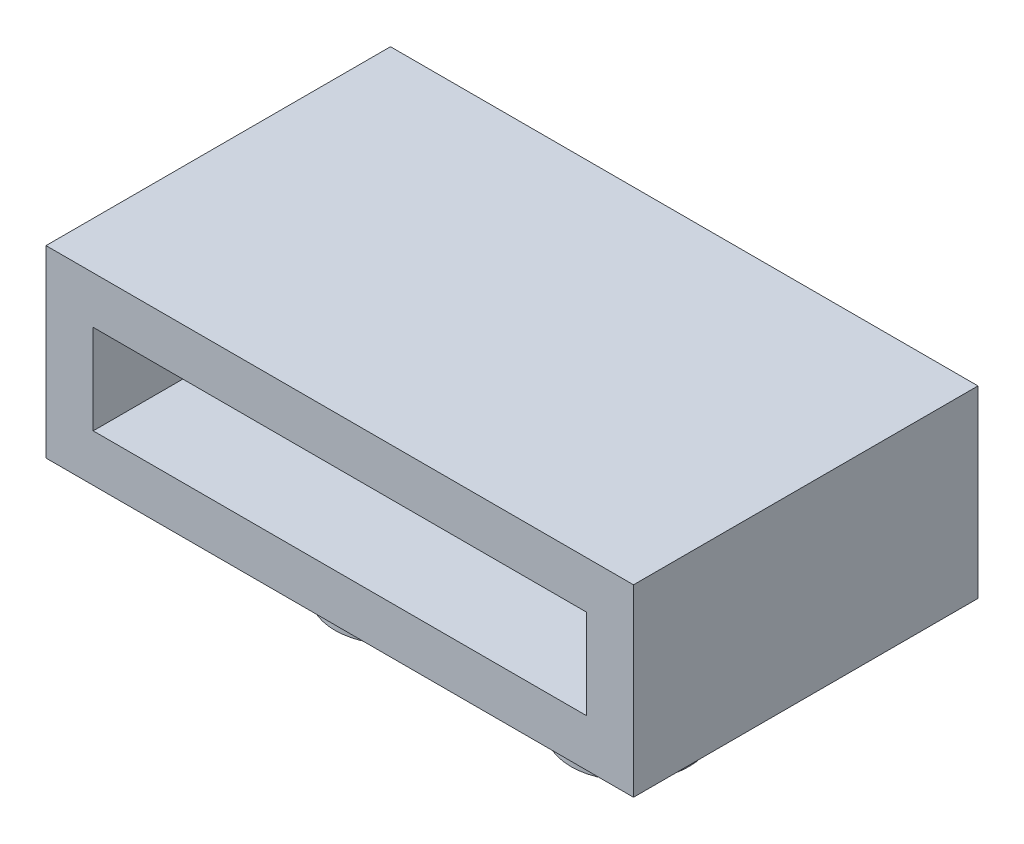
ISO-10303-21;
HEADER;
FILE_DESCRIPTION(('STEP AP214'),'2;1');
FILE_NAME('part.step','',(''),(''),'','','');
FILE_SCHEMA(('AUTOMOTIVE_DESIGN { 1 0 10303 214 1 1 1 1 }'));
ENDSEC;
DATA;
#1=APPLICATION_CONTEXT('core data for automotive mechanical design processes');
#2=APPLICATION_PROTOCOL_DEFINITION('international standard','automotive_design',2000,#1);
#3=PRODUCT_CONTEXT('',#1,'mechanical');
#4=PRODUCT('Part','Part','',(#3));
#5=PRODUCT_RELATED_PRODUCT_CATEGORY('part','',(#4));
#6=PRODUCT_DEFINITION_FORMATION('','',#4);
#7=PRODUCT_DEFINITION_CONTEXT('part definition',#1,'design');
#8=PRODUCT_DEFINITION('design','',#6,#7);
#9=PRODUCT_DEFINITION_SHAPE('','',#8);
#10=(LENGTH_UNIT() NAMED_UNIT(*) SI_UNIT(.MILLI.,.METRE.));
#11=(NAMED_UNIT(*) PLANE_ANGLE_UNIT() SI_UNIT($,.RADIAN.));
#12=(NAMED_UNIT(*) SI_UNIT($,.STERADIAN.) SOLID_ANGLE_UNIT());
#13=UNCERTAINTY_MEASURE_WITH_UNIT(LENGTH_MEASURE(1.E-05),#10,'distance_accuracy_value','');
#14=(GEOMETRIC_REPRESENTATION_CONTEXT(3) GLOBAL_UNCERTAINTY_ASSIGNED_CONTEXT((#13)) GLOBAL_UNIT_ASSIGNED_CONTEXT((#10,
#11,#12)) REPRESENTATION_CONTEXT('',''));
#15=CARTESIAN_POINT('',(0.,0.,0.));
#16=DIRECTION('',(0.,0.,1.));
#17=DIRECTION('',(1.,0.,0.));
#18=AXIS2_PLACEMENT_3D('',#15,#16,#17);
#19=CARTESIAN_POINT('',(20.9,3.8,0.));
#20=DIRECTION('',(-1.,0.,0.));
#21=DIRECTION('',(0.,0.,1.));
#22=AXIS2_PLACEMENT_3D('',#19,#20,#21);
#23=PLANE('',#22);
#24=DIRECTION('',(0.,0.,-1.));
#25=VECTOR('',#24,1.);
#26=CARTESIAN_POINT('',(20.9,0.,0.));
#27=LINE('',#26,#25);
#28=CARTESIAN_POINT('',(20.9,0.,0.));
#29=VERTEX_POINT('',#28);
#30=CARTESIAN_POINT('',(20.9,0.,-12.6));
#31=VERTEX_POINT('',#30);
#32=EDGE_CURVE('E173',#29,#31,#27,.T.);
#33=ORIENTED_EDGE('',*,*,#32,.F.);
#34=DIRECTION('',(0.,-1.,0.));
#35=VECTOR('',#34,1.);
#36=CARTESIAN_POINT('',(20.9,3.8,0.));
#37=LINE('',#36,#35);
#38=CARTESIAN_POINT('',(20.9,3.8,0.));
#39=VERTEX_POINT('',#38);
#40=EDGE_CURVE('E212',#39,#29,#37,.T.);
#41=ORIENTED_EDGE('',*,*,#40,.F.);
#42=DIRECTION('',(0.,0.,-1.));
#43=VECTOR('',#42,1.);
#44=CARTESIAN_POINT('',(20.9,3.8,0.));
#45=LINE('',#44,#43);
#46=CARTESIAN_POINT('',(20.9,3.8,-12.6));
#47=VERTEX_POINT('',#46);
#48=EDGE_CURVE('E176',#39,#47,#45,.T.);
#49=ORIENTED_EDGE('',*,*,#48,.T.);
#50=DIRECTION('',(0.,-1.,0.));
#51=VECTOR('',#50,1.);
#52=CARTESIAN_POINT('',(20.9,3.8,-12.6));
#53=LINE('',#52,#51);
#54=EDGE_CURVE('E188',#47,#31,#53,.T.);
#55=ORIENTED_EDGE('',*,*,#54,.T.);
#56=EDGE_LOOP('',(#33,#41,#49,#55));
#57=FACE_BOUND('',#56,.T.);
#58=ADVANCED_FACE('F49',(#57),#23,.T.);
#59=CARTESIAN_POINT('',(22.9,3.8,0.));
#60=DIRECTION('',(-1.,0.,0.));
#61=DIRECTION('',(0.,0.,1.));
#62=AXIS2_PLACEMENT_3D('',#59,#60,#61);
#63=PLANE('',#62);
#64=DIRECTION('',(0.,-1.,0.));
#65=VECTOR('',#64,1.);
#66=CARTESIAN_POINT('',(22.9,3.8,0.));
#67=LINE('',#66,#65);
#68=CARTESIAN_POINT('',(22.9,5.8,0.));
#69=VERTEX_POINT('',#68);
#70=CARTESIAN_POINT('',(22.9,-2.,0.));
#71=VERTEX_POINT('',#70);
#72=EDGE_CURVE('E129',#69,#71,#67,.T.);
#73=ORIENTED_EDGE('',*,*,#72,.T.);
#74=DIRECTION('',(0.,0.,-1.));
#75=VECTOR('',#74,1.);
#76=CARTESIAN_POINT('',(22.9,-2.,0.));
#77=LINE('',#76,#75);
#78=CARTESIAN_POINT('',(22.9,-2.,-14.6));
#79=VERTEX_POINT('',#78);
#80=EDGE_CURVE('E163',#71,#79,#77,.T.);
#81=ORIENTED_EDGE('',*,*,#80,.T.);
#82=DIRECTION('',(0.,-1.,0.));
#83=VECTOR('',#82,1.);
#84=CARTESIAN_POINT('',(22.9,3.8,-14.6));
#85=LINE('',#84,#83);
#86=CARTESIAN_POINT('',(22.9,5.8,-14.6));
#87=VERTEX_POINT('',#86);
#88=EDGE_CURVE('E207',#87,#79,#85,.T.);
#89=ORIENTED_EDGE('',*,*,#88,.F.);
#90=DIRECTION('',(0.,0.,-1.));
#91=VECTOR('',#90,1.);
#92=CARTESIAN_POINT('',(22.9,5.8,-14.6));
#93=LINE('',#92,#91);
#94=EDGE_CURVE('E134',#69,#87,#93,.T.);
#95=ORIENTED_EDGE('',*,*,#94,.F.);
#96=EDGE_LOOP('',(#73,#81,#89,#95));
#97=FACE_BOUND('',#96,.T.);
#98=ADVANCED_FACE('F231',(#97),#63,.F.);
#99=CARTESIAN_POINT('',(0.,3.8,-14.6));
#100=DIRECTION('',(0.,0.,-1.));
#101=DIRECTION('',(-1.,0.,0.));
#102=AXIS2_PLACEMENT_3D('',#99,#100,#101);
#103=PLANE('',#102);
#104=ORIENTED_EDGE('',*,*,#88,.T.);
#105=DIRECTION('',(1.,0.,0.));
#106=VECTOR('',#105,1.);
#107=CARTESIAN_POINT('',(0.,-2.,-14.6));
#108=LINE('',#107,#106);
#109=CARTESIAN_POINT('',(-2.,-2.,-14.6));
#110=VERTEX_POINT('',#109);
#111=EDGE_CURVE('E167',#110,#79,#108,.T.);
#112=ORIENTED_EDGE('',*,*,#111,.F.);
#113=DIRECTION('',(0.,-1.,0.));
#114=VECTOR('',#113,1.);
#115=CARTESIAN_POINT('',(-2.,3.8,-14.6));
#116=LINE('',#115,#114);
#117=CARTESIAN_POINT('',(-2.,5.8,-14.6));
#118=VERTEX_POINT('',#117);
#119=EDGE_CURVE('E122',#118,#110,#116,.T.);
#120=ORIENTED_EDGE('',*,*,#119,.F.);
#121=DIRECTION('',(-1.,0.,0.));
#122=VECTOR('',#121,1.);
#123=CARTESIAN_POINT('',(-2.,5.8,-14.6));
#124=LINE('',#123,#122);
#125=EDGE_CURVE('E139',#87,#118,#124,.T.);
#126=ORIENTED_EDGE('',*,*,#125,.F.);
#127=EDGE_LOOP('',(#104,#112,#120,#126));
#128=FACE_BOUND('',#127,.T.);
#129=ADVANCED_FACE('F233',(#128),#103,.T.);
#130=CARTESIAN_POINT('',(-2.,3.8,0.));
#131=DIRECTION('',(-1.,0.,0.));
#132=DIRECTION('',(0.,0.,1.));
#133=AXIS2_PLACEMENT_3D('',#130,#131,#132);
#134=PLANE('',#133);
#135=ORIENTED_EDGE('',*,*,#119,.T.);
#136=DIRECTION('',(0.,0.,-1.));
#137=VECTOR('',#136,1.);
#138=CARTESIAN_POINT('',(-2.,-2.,0.));
#139=LINE('',#138,#137);
#140=CARTESIAN_POINT('',(-2.,-2.,0.));
#141=VERTEX_POINT('',#140);
#142=EDGE_CURVE('E117',#141,#110,#139,.T.);
#143=ORIENTED_EDGE('',*,*,#142,.F.);
#144=DIRECTION('',(0.,-1.,0.));
#145=VECTOR('',#144,1.);
#146=CARTESIAN_POINT('',(-2.,3.8,0.));
#147=LINE('',#146,#145);
#148=CARTESIAN_POINT('',(-2.,5.8,0.));
#149=VERTEX_POINT('',#148);
#150=EDGE_CURVE('E111',#149,#141,#147,.T.);
#151=ORIENTED_EDGE('',*,*,#150,.F.);
#152=DIRECTION('',(0.,0.,1.));
#153=VECTOR('',#152,1.);
#154=CARTESIAN_POINT('',(-2.,5.8,-14.6));
#155=LINE('',#154,#153);
#156=EDGE_CURVE('E115',#118,#149,#155,.T.);
#157=ORIENTED_EDGE('',*,*,#156,.F.);
#158=EDGE_LOOP('',(#135,#143,#151,#157));
#159=FACE_BOUND('',#158,.T.);
#160=ADVANCED_FACE('F113',(#159),#134,.T.);
#161=CARTESIAN_POINT('',(0.,3.8,0.));
#162=DIRECTION('',(0.,0.,-1.));
#163=DIRECTION('',(-1.,0.,0.));
#164=AXIS2_PLACEMENT_3D('',#161,#162,#163);
#165=PLANE('',#164);
#166=ORIENTED_EDGE('',*,*,#72,.F.);
#167=DIRECTION('',(1.,0.,0.));
#168=VECTOR('',#167,1.);
#169=CARTESIAN_POINT('',(-2.,5.8,0.));
#170=LINE('',#169,#168);
#171=EDGE_CURVE('E126',#149,#69,#170,.T.);
#172=ORIENTED_EDGE('',*,*,#171,.F.);
#173=ORIENTED_EDGE('',*,*,#150,.T.);
#174=DIRECTION('',(1.,0.,0.));
#175=VECTOR('',#174,1.);
#176=CARTESIAN_POINT('',(0.,-2.,0.));
#177=LINE('',#176,#175);
#178=EDGE_CURVE('E160',#141,#71,#177,.T.);
#179=ORIENTED_EDGE('',*,*,#178,.T.);
#180=EDGE_LOOP('',(#166,#172,#173,#179));
#181=FACE_BOUND('',#180,.T.);
#182=DIRECTION('',(1.,0.,0.));
#183=VECTOR('',#182,1.);
#184=CARTESIAN_POINT('',(-2.,3.8,0.));
#185=LINE('',#184,#183);
#186=CARTESIAN_POINT('',(0.,3.8,0.));
#187=VERTEX_POINT('',#186);
#188=EDGE_CURVE('E141',#187,#39,#185,.T.);
#189=ORIENTED_EDGE('',*,*,#188,.T.);
#190=ORIENTED_EDGE('',*,*,#40,.T.);
#191=DIRECTION('',(1.,0.,0.));
#192=VECTOR('',#191,1.);
#193=CARTESIAN_POINT('',(0.,0.,0.));
#194=LINE('',#193,#192);
#195=CARTESIAN_POINT('',(0.,0.,0.));
#196=VERTEX_POINT('',#195);
#197=EDGE_CURVE('E159',#196,#29,#194,.T.);
#198=ORIENTED_EDGE('',*,*,#197,.F.);
#199=DIRECTION('',(0.,-1.,0.));
#200=VECTOR('',#199,1.);
#201=CARTESIAN_POINT('',(0.,3.8,0.));
#202=LINE('',#201,#200);
#203=EDGE_CURVE('E123',#187,#196,#202,.T.);
#204=ORIENTED_EDGE('',*,*,#203,.F.);
#205=EDGE_LOOP('',(#189,#190,#198,#204));
#206=FACE_BOUND('',#205,.T.);
#207=ADVANCED_FACE('F127',(#181,#206),#165,.F.);
#208=CARTESIAN_POINT('',(0.,3.8,0.));
#209=DIRECTION('',(-1.,0.,0.));
#210=DIRECTION('',(0.,0.,1.));
#211=AXIS2_PLACEMENT_3D('',#208,#209,#210);
#212=PLANE('',#211);
#213=DIRECTION('',(0.,0.,-1.));
#214=VECTOR('',#213,1.);
#215=CARTESIAN_POINT('',(0.,0.,0.));
#216=LINE('',#215,#214);
#217=CARTESIAN_POINT('',(0.,0.,-12.6));
#218=VERTEX_POINT('',#217);
#219=EDGE_CURVE('E191',#196,#218,#216,.T.);
#220=ORIENTED_EDGE('',*,*,#219,.T.);
#221=DIRECTION('',(0.,-1.,0.));
#222=VECTOR('',#221,1.);
#223=CARTESIAN_POINT('',(0.,3.8,-12.6));
#224=LINE('',#223,#222);
#225=CARTESIAN_POINT('',(0.,3.8,-12.6));
#226=VERTEX_POINT('',#225);
#227=EDGE_CURVE('E65',#226,#218,#224,.T.);
#228=ORIENTED_EDGE('',*,*,#227,.F.);
#229=DIRECTION('',(0.,0.,-1.));
#230=VECTOR('',#229,1.);
#231=CARTESIAN_POINT('',(0.,3.8,0.));
#232=LINE('',#231,#230);
#233=EDGE_CURVE('E179',#187,#226,#232,.T.);
#234=ORIENTED_EDGE('',*,*,#233,.F.);
#235=ORIENTED_EDGE('',*,*,#203,.T.);
#236=EDGE_LOOP('',(#220,#228,#234,#235));
#237=FACE_BOUND('',#236,.T.);
#238=ADVANCED_FACE('F257',(#237),#212,.F.);
#239=CARTESIAN_POINT('',(0.,3.8,-12.6));
#240=DIRECTION('',(0.,0.,-1.));
#241=DIRECTION('',(-1.,0.,0.));
#242=AXIS2_PLACEMENT_3D('',#239,#240,#241);
#243=PLANE('',#242);
#244=DIRECTION('',(1.,0.,0.));
#245=VECTOR('',#244,1.);
#246=CARTESIAN_POINT('',(0.,0.,-12.6));
#247=LINE('',#246,#245);
#248=EDGE_CURVE('E180',#218,#31,#247,.T.);
#249=ORIENTED_EDGE('',*,*,#248,.T.);
#250=ORIENTED_EDGE('',*,*,#54,.F.);
#251=DIRECTION('',(1.,0.,0.));
#252=VECTOR('',#251,1.);
#253=CARTESIAN_POINT('',(0.,3.8,-12.6));
#254=LINE('',#253,#252);
#255=EDGE_CURVE('E184',#226,#47,#254,.T.);
#256=ORIENTED_EDGE('',*,*,#255,.F.);
#257=ORIENTED_EDGE('',*,*,#227,.T.);
#258=EDGE_LOOP('',(#249,#250,#256,#257));
#259=FACE_BOUND('',#258,.T.);
#260=ADVANCED_FACE('F225',(#259),#243,.F.);
#261=CARTESIAN_POINT('',(0.,-2.,0.));
#262=DIRECTION('',(0.,1.,0.));
#263=DIRECTION('',(0.,0.,1.));
#264=AXIS2_PLACEMENT_3D('',#261,#262,#263);
#265=PLANE('',#264);
#266=CARTESIAN_POINT('',(15.45,-2.,-7.3));
#267=DIRECTION('',(0.,1.,0.));
#268=DIRECTION('',(0.,0.,1.));
#269=AXIS2_PLACEMENT_3D('',#266,#267,#268);
#270=CIRCLE('',#269,2.5);
#271=CARTESIAN_POINT('',(15.45,-2.,-4.8));
#272=VERTEX_POINT('',#271);
#273=EDGE_CURVE('E11',#272,#272,#270,.F.);
#274=ORIENTED_EDGE('',*,*,#273,.F.);
#275=EDGE_LOOP('',(#274));
#276=FACE_BOUND('',#275,.T.);
#277=CARTESIAN_POINT('',(5.45,-2.,-7.3));
#278=DIRECTION('',(0.,1.,0.));
#279=DIRECTION('',(0.,0.,1.));
#280=AXIS2_PLACEMENT_3D('',#277,#278,#279);
#281=CIRCLE('',#280,2.5);
#282=CARTESIAN_POINT('',(5.45,-2.,-4.8));
#283=VERTEX_POINT('',#282);
#284=EDGE_CURVE('E58',#283,#283,#281,.F.);
#285=ORIENTED_EDGE('',*,*,#284,.F.);
#286=EDGE_LOOP('',(#285));
#287=FACE_BOUND('',#286,.T.);
#288=ORIENTED_EDGE('',*,*,#178,.F.);
#289=ORIENTED_EDGE('',*,*,#142,.T.);
#290=ORIENTED_EDGE('',*,*,#111,.T.);
#291=ORIENTED_EDGE('',*,*,#80,.F.);
#292=EDGE_LOOP('',(#288,#289,#290,#291));
#293=FACE_BOUND('',#292,.T.);
#294=ADVANCED_FACE('F221',(#276,#287,#293),#265,.F.);
#295=CARTESIAN_POINT('',(0.,0.,0.));
#296=DIRECTION('',(0.,1.,0.));
#297=DIRECTION('',(0.,0.,1.));
#298=AXIS2_PLACEMENT_3D('',#295,#296,#297);
#299=PLANE('',#298);
#300=ORIENTED_EDGE('',*,*,#197,.T.);
#301=ORIENTED_EDGE('',*,*,#32,.T.);
#302=ORIENTED_EDGE('',*,*,#248,.F.);
#303=ORIENTED_EDGE('',*,*,#219,.F.);
#304=EDGE_LOOP('',(#300,#301,#302,#303));
#305=FACE_BOUND('',#304,.T.);
#306=ADVANCED_FACE('F224',(#305),#299,.T.);
#307=CARTESIAN_POINT('',(5.45,-7.,-7.3));
#308=DIRECTION('',(0.,1.,0.));
#309=DIRECTION('',(0.,0.,1.));
#310=AXIS2_PLACEMENT_3D('',#307,#308,#309);
#311=CYLINDRICAL_SURFACE('',#310,2.5);
#312=CARTESIAN_POINT('',(5.45,-7.,-7.3));
#313=DIRECTION('',(0.,-1.,0.));
#314=DIRECTION('',(0.,0.,-1.));
#315=AXIS2_PLACEMENT_3D('',#312,#313,#314);
#316=CIRCLE('',#315,2.5);
#317=CARTESIAN_POINT('',(5.45,-7.,-9.8));
#318=VERTEX_POINT('',#317);
#319=EDGE_CURVE('E155',#318,#318,#316,.T.);
#320=ORIENTED_EDGE('',*,*,#319,.F.);
#321=EDGE_LOOP('',(#320));
#322=FACE_BOUND('',#321,.T.);
#323=ORIENTED_EDGE('',*,*,#284,.T.);
#324=EDGE_LOOP('',(#323));
#325=FACE_BOUND('',#324,.T.);
#326=ADVANCED_FACE('F219',(#322,#325),#311,.T.);
#327=CARTESIAN_POINT('',(5.45,-7.,-7.3));
#328=DIRECTION('',(0.,-1.,0.));
#329=DIRECTION('',(0.,0.,-1.));
#330=AXIS2_PLACEMENT_3D('',#327,#328,#329);
#331=PLANE('',#330);
#332=ORIENTED_EDGE('',*,*,#319,.T.);
#333=EDGE_LOOP('',(#332));
#334=FACE_BOUND('',#333,.T.);
#335=ADVANCED_FACE('F351',(#334),#331,.T.);
#336=CARTESIAN_POINT('',(15.45,-7.,-7.3));
#337=DIRECTION('',(0.,1.,0.));
#338=DIRECTION('',(0.,0.,1.));
#339=AXIS2_PLACEMENT_3D('',#336,#337,#338);
#340=CYLINDRICAL_SURFACE('',#339,2.5);
#341=CARTESIAN_POINT('',(15.45,-7.,-7.3));
#342=DIRECTION('',(0.,-1.,0.));
#343=DIRECTION('',(0.,0.,1.));
#344=AXIS2_PLACEMENT_3D('',#341,#342,#343);
#345=CIRCLE('',#344,2.5);
#346=CARTESIAN_POINT('',(15.45,-7.,-4.8));
#347=VERTEX_POINT('',#346);
#348=EDGE_CURVE('E150',#347,#347,#345,.T.);
#349=ORIENTED_EDGE('',*,*,#348,.F.);
#350=EDGE_LOOP('',(#349));
#351=FACE_BOUND('',#350,.T.);
#352=ORIENTED_EDGE('',*,*,#273,.T.);
#353=EDGE_LOOP('',(#352));
#354=FACE_BOUND('',#353,.T.);
#355=ADVANCED_FACE('F340',(#351,#354),#340,.T.);
#356=CARTESIAN_POINT('',(15.45,-7.,-7.3));
#357=DIRECTION('',(0.,1.,0.));
#358=DIRECTION('',(0.,0.,1.));
#359=AXIS2_PLACEMENT_3D('',#356,#357,#358);
#360=PLANE('',#359);
#361=ORIENTED_EDGE('',*,*,#348,.T.);
#362=EDGE_LOOP('',(#361));
#363=FACE_BOUND('',#362,.T.);
#364=ADVANCED_FACE('F335',(#363),#360,.F.);
#365=CARTESIAN_POINT('',(0.,5.8,0.));
#366=DIRECTION('',(0.,1.,0.));
#367=DIRECTION('',(0.,0.,1.));
#368=AXIS2_PLACEMENT_3D('',#365,#366,#367);
#369=PLANE('',#368);
#370=ORIENTED_EDGE('',*,*,#156,.T.);
#371=ORIENTED_EDGE('',*,*,#171,.T.);
#372=ORIENTED_EDGE('',*,*,#94,.T.);
#373=ORIENTED_EDGE('',*,*,#125,.T.);
#374=EDGE_LOOP('',(#370,#371,#372,#373));
#375=FACE_BOUND('',#374,.T.);
#376=ADVANCED_FACE('F137',(#375),#369,.T.);
#377=CARTESIAN_POINT('',(0.,3.8,0.));
#378=DIRECTION('',(0.,1.,0.));
#379=DIRECTION('',(0.,0.,1.));
#380=AXIS2_PLACEMENT_3D('',#377,#378,#379);
#381=PLANE('',#380);
#382=ORIENTED_EDGE('',*,*,#48,.F.);
#383=ORIENTED_EDGE('',*,*,#188,.F.);
#384=ORIENTED_EDGE('',*,*,#233,.T.);
#385=ORIENTED_EDGE('',*,*,#255,.T.);
#386=EDGE_LOOP('',(#382,#383,#384,#385));
#387=FACE_BOUND('',#386,.T.);
#388=ADVANCED_FACE('F254',(#387),#381,.F.);
#389=CLOSED_SHELL('',(#58,#98,#129,#160,#207,#238,#260,#294,#306,#326,#335,#355,#364,#376,#388));
#390=MANIFOLD_SOLID_BREP('B2',#389);
#391=ADVANCED_BREP_SHAPE_REPRESENTATION('',(#18,#390),#14);
#392=SHAPE_DEFINITION_REPRESENTATION(#9,#391);
ENDSEC;
END-ISO-10303-21;
